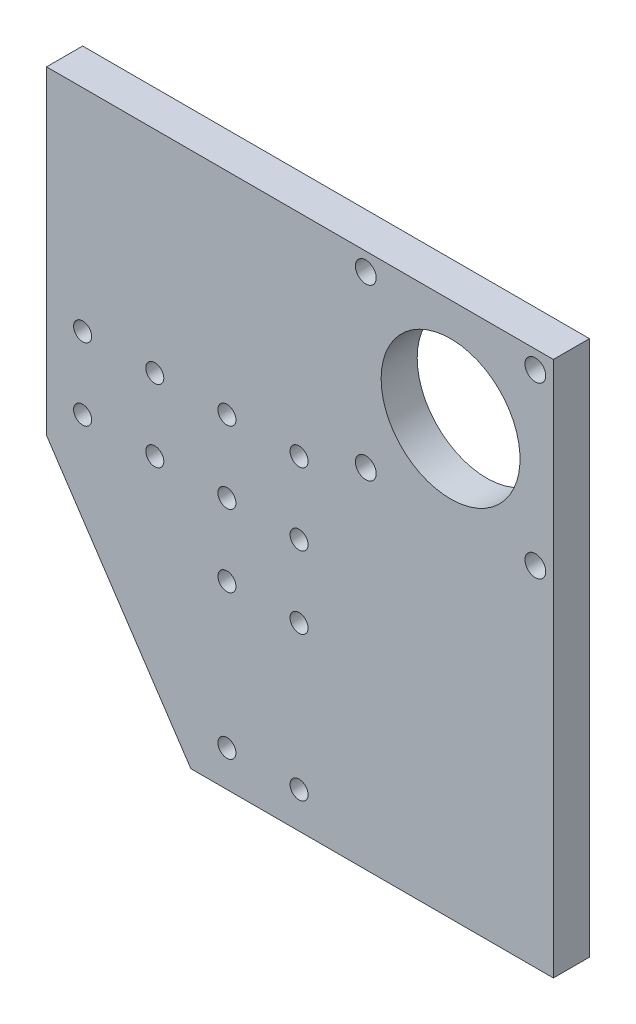
ISO-10303-21;
HEADER;
FILE_DESCRIPTION(('STEP AP214'),'2;1');
FILE_NAME('part.step','',(''),(''),'','','');
FILE_SCHEMA(('AUTOMOTIVE_DESIGN { 1 0 10303 214 1 1 1 1 }'));
ENDSEC;
DATA;
#1=APPLICATION_CONTEXT('core data for automotive mechanical design processes');
#2=APPLICATION_PROTOCOL_DEFINITION('international standard','automotive_design',2000,#1);
#3=PRODUCT_CONTEXT('',#1,'mechanical');
#4=PRODUCT('Part','Part','',(#3));
#5=PRODUCT_RELATED_PRODUCT_CATEGORY('part','',(#4));
#6=PRODUCT_DEFINITION_FORMATION('','',#4);
#7=PRODUCT_DEFINITION_CONTEXT('part definition',#1,'design');
#8=PRODUCT_DEFINITION('design','',#6,#7);
#9=PRODUCT_DEFINITION_SHAPE('','',#8);
#10=(LENGTH_UNIT() NAMED_UNIT(*) SI_UNIT(.MILLI.,.METRE.));
#11=(NAMED_UNIT(*) PLANE_ANGLE_UNIT() SI_UNIT($,.RADIAN.));
#12=(NAMED_UNIT(*) SI_UNIT($,.STERADIAN.) SOLID_ANGLE_UNIT());
#13=UNCERTAINTY_MEASURE_WITH_UNIT(LENGTH_MEASURE(1.E-05),#10,'distance_accuracy_value','');
#14=(GEOMETRIC_REPRESENTATION_CONTEXT(3) GLOBAL_UNCERTAINTY_ASSIGNED_CONTEXT((#13)) GLOBAL_UNIT_ASSIGNED_CONTEXT((#10,
#11,#12)) REPRESENTATION_CONTEXT('',''));
#15=CARTESIAN_POINT('',(0.,0.,0.));
#16=DIRECTION('',(0.,0.,1.));
#17=DIRECTION('',(1.,0.,0.));
#18=AXIS2_PLACEMENT_3D('',#15,#16,#17);
#19=CARTESIAN_POINT('',(0.,0.,10.));
#20=DIRECTION('',(0.832050294337844,0.554700196225229,0.));
#21=DIRECTION('',(-0.554700196225229,0.832050294337844,0.));
#22=AXIS2_PLACEMENT_3D('',#19,#20,#21);
#23=PLANE('',#22);
#24=DIRECTION('',(0.554700196225229,-0.832050294337844,0.));
#25=VECTOR('',#24,1.);
#26=CARTESIAN_POINT('',(0.,0.,0.));
#27=LINE('',#26,#25);
#28=CARTESIAN_POINT('',(-40.,60.,0.));
#29=VERTEX_POINT('',#28);
#30=CARTESIAN_POINT('',(0.,0.,0.));
#31=VERTEX_POINT('',#30);
#32=EDGE_CURVE('E122',#29,#31,#27,.T.);
#33=ORIENTED_EDGE('',*,*,#32,.T.);
#34=DIRECTION('',(0.,0.,-1.));
#35=VECTOR('',#34,1.);
#36=CARTESIAN_POINT('',(0.,0.,10.));
#37=LINE('',#36,#35);
#38=CARTESIAN_POINT('',(0.,0.,10.));
#39=VERTEX_POINT('',#38);
#40=EDGE_CURVE('E11',#39,#31,#37,.T.);
#41=ORIENTED_EDGE('',*,*,#40,.F.);
#42=DIRECTION('',(0.554700196225229,-0.832050294337844,0.));
#43=VECTOR('',#42,1.);
#44=CARTESIAN_POINT('',(0.,0.,10.));
#45=LINE('',#44,#43);
#46=CARTESIAN_POINT('',(-40.,60.,10.));
#47=VERTEX_POINT('',#46);
#48=EDGE_CURVE('E136',#47,#39,#45,.T.);
#49=ORIENTED_EDGE('',*,*,#48,.F.);
#50=DIRECTION('',(0.,0.,-1.));
#51=VECTOR('',#50,1.);
#52=CARTESIAN_POINT('',(-40.,60.,10.));
#53=LINE('',#52,#51);
#54=EDGE_CURVE('E118',#47,#29,#53,.T.);
#55=ORIENTED_EDGE('',*,*,#54,.T.);
#56=EDGE_LOOP('',(#33,#41,#49,#55));
#57=FACE_BOUND('',#56,.T.);
#58=ADVANCED_FACE('F43',(#57),#23,.F.);
#59=CARTESIAN_POINT('',(0.,0.,10.));
#60=DIRECTION('',(0.,1.,0.));
#61=DIRECTION('',(0.,0.,1.));
#62=AXIS2_PLACEMENT_3D('',#59,#60,#61);
#63=PLANE('',#62);
#64=DIRECTION('',(1.,0.,0.));
#65=VECTOR('',#64,1.);
#66=CARTESIAN_POINT('',(0.,0.,0.));
#67=LINE('',#66,#65);
#68=CARTESIAN_POINT('',(100.5,0.,0.));
#69=VERTEX_POINT('',#68);
#70=EDGE_CURVE('E126',#31,#69,#67,.T.);
#71=ORIENTED_EDGE('',*,*,#70,.T.);
#72=DIRECTION('',(0.,0.,-1.));
#73=VECTOR('',#72,1.);
#74=CARTESIAN_POINT('',(100.5,0.,10.));
#75=LINE('',#74,#73);
#76=CARTESIAN_POINT('',(100.5,0.,10.));
#77=VERTEX_POINT('',#76);
#78=EDGE_CURVE('E52',#77,#69,#75,.T.);
#79=ORIENTED_EDGE('',*,*,#78,.F.);
#80=DIRECTION('',(1.,0.,0.));
#81=VECTOR('',#80,1.);
#82=CARTESIAN_POINT('',(0.,0.,10.));
#83=LINE('',#82,#81);
#84=EDGE_CURVE('E94',#39,#77,#83,.T.);
#85=ORIENTED_EDGE('',*,*,#84,.F.);
#86=ORIENTED_EDGE('',*,*,#40,.T.);
#87=EDGE_LOOP('',(#71,#79,#85,#86));
#88=FACE_BOUND('',#87,.T.);
#89=ADVANCED_FACE('F159',(#88),#63,.F.);
#90=CARTESIAN_POINT('',(100.5,148.49893218,10.));
#91=DIRECTION('',(-1.,0.,0.));
#92=DIRECTION('',(0.,-1.,0.));
#93=AXIS2_PLACEMENT_3D('',#90,#91,#92);
#94=PLANE('',#93);
#95=DIRECTION('',(0.,1.,0.));
#96=VECTOR('',#95,1.);
#97=CARTESIAN_POINT('',(100.5,148.49893218,0.));
#98=LINE('',#97,#96);
#99=CARTESIAN_POINT('',(100.5,148.49893218,0.));
#100=VERTEX_POINT('',#99);
#101=EDGE_CURVE('E110',#69,#100,#98,.T.);
#102=ORIENTED_EDGE('',*,*,#101,.T.);
#103=DIRECTION('',(0.,0.,-1.));
#104=VECTOR('',#103,1.);
#105=CARTESIAN_POINT('',(100.5,148.49893218,10.));
#106=LINE('',#105,#104);
#107=CARTESIAN_POINT('',(100.5,148.49893218,10.));
#108=VERTEX_POINT('',#107);
#109=EDGE_CURVE('E107',#108,#100,#106,.T.);
#110=ORIENTED_EDGE('',*,*,#109,.F.);
#111=DIRECTION('',(0.,1.,0.));
#112=VECTOR('',#111,1.);
#113=CARTESIAN_POINT('',(100.5,148.49893218,10.));
#114=LINE('',#113,#112);
#115=EDGE_CURVE('E98',#77,#108,#114,.T.);
#116=ORIENTED_EDGE('',*,*,#115,.F.);
#117=ORIENTED_EDGE('',*,*,#78,.T.);
#118=EDGE_LOOP('',(#102,#110,#116,#117));
#119=FACE_BOUND('',#118,.T.);
#120=ADVANCED_FACE('F108',(#119),#94,.F.);
#121=CARTESIAN_POINT('',(-40.,148.49893218,10.));
#122=DIRECTION('',(0.,-1.,0.));
#123=DIRECTION('',(0.,0.,-1.));
#124=AXIS2_PLACEMENT_3D('',#121,#122,#123);
#125=PLANE('',#124);
#126=DIRECTION('',(-1.,0.,0.));
#127=VECTOR('',#126,1.);
#128=CARTESIAN_POINT('',(-40.,148.49893218,0.));
#129=LINE('',#128,#127);
#130=CARTESIAN_POINT('',(-40.,148.49893218,0.));
#131=VERTEX_POINT('',#130);
#132=EDGE_CURVE('E80',#100,#131,#129,.T.);
#133=ORIENTED_EDGE('',*,*,#132,.T.);
#134=DIRECTION('',(0.,0.,-1.));
#135=VECTOR('',#134,1.);
#136=CARTESIAN_POINT('',(-40.,148.49893218,10.));
#137=LINE('',#136,#135);
#138=CARTESIAN_POINT('',(-40.,148.49893218,10.));
#139=VERTEX_POINT('',#138);
#140=EDGE_CURVE('E112',#139,#131,#137,.T.);
#141=ORIENTED_EDGE('',*,*,#140,.F.);
#142=DIRECTION('',(-1.,0.,0.));
#143=VECTOR('',#142,1.);
#144=CARTESIAN_POINT('',(-40.,148.49893218,10.));
#145=LINE('',#144,#143);
#146=EDGE_CURVE('E102',#108,#139,#145,.T.);
#147=ORIENTED_EDGE('',*,*,#146,.F.);
#148=ORIENTED_EDGE('',*,*,#109,.T.);
#149=EDGE_LOOP('',(#133,#141,#147,#148));
#150=FACE_BOUND('',#149,.T.);
#151=ADVANCED_FACE('F114',(#150),#125,.F.);
#152=CARTESIAN_POINT('',(-40.,60.,10.));
#153=DIRECTION('',(1.,0.,0.));
#154=DIRECTION('',(0.,0.,-1.));
#155=AXIS2_PLACEMENT_3D('',#152,#153,#154);
#156=PLANE('',#155);
#157=DIRECTION('',(0.,-1.,0.));
#158=VECTOR('',#157,1.);
#159=CARTESIAN_POINT('',(-40.,60.,0.));
#160=LINE('',#159,#158);
#161=EDGE_CURVE('E86',#131,#29,#160,.T.);
#162=ORIENTED_EDGE('',*,*,#161,.T.);
#163=ORIENTED_EDGE('',*,*,#54,.F.);
#164=DIRECTION('',(0.,-1.,0.));
#165=VECTOR('',#164,1.);
#166=CARTESIAN_POINT('',(-40.,60.,10.));
#167=LINE('',#166,#165);
#168=EDGE_CURVE('E60',#139,#47,#167,.T.);
#169=ORIENTED_EDGE('',*,*,#168,.F.);
#170=ORIENTED_EDGE('',*,*,#140,.T.);
#171=EDGE_LOOP('',(#162,#163,#169,#170));
#172=FACE_BOUND('',#171,.T.);
#173=ADVANCED_FACE('F147',(#172),#156,.F.);
#174=CARTESIAN_POINT('',(0.,0.,10.));
#175=DIRECTION('',(0.,0.,-1.));
#176=DIRECTION('',(-1.,0.,0.));
#177=AXIS2_PLACEMENT_3D('',#174,#175,#176);
#178=PLANE('',#177);
#179=CARTESIAN_POINT('',(30.,50.,10.));
#180=DIRECTION('',(0.,0.,-1.));
#181=DIRECTION('',(-1.,0.,0.));
#182=AXIS2_PLACEMENT_3D('',#179,#180,#181);
#183=CIRCLE('',#182,2.5);
#184=CARTESIAN_POINT('',(27.5,50.,10.));
#185=VERTEX_POINT('',#184);
#186=EDGE_CURVE('E429',#185,#185,#183,.F.);
#187=ORIENTED_EDGE('',*,*,#186,.F.);
#188=EDGE_LOOP('',(#187));
#189=FACE_BOUND('',#188,.T.);
#190=CARTESIAN_POINT('',(10.,50.,10.));
#191=DIRECTION('',(0.,0.,-1.));
#192=DIRECTION('',(-1.,0.,0.));
#193=AXIS2_PLACEMENT_3D('',#190,#191,#192);
#194=CIRCLE('',#193,2.5);
#195=CARTESIAN_POINT('',(7.50000000000002,50.,10.));
#196=VERTEX_POINT('',#195);
#197=EDGE_CURVE('E438',#196,#196,#194,.F.);
#198=ORIENTED_EDGE('',*,*,#197,.F.);
#199=EDGE_LOOP('',(#198));
#200=FACE_BOUND('',#199,.T.);
#201=CARTESIAN_POINT('',(30.,10.,10.));
#202=DIRECTION('',(0.,0.,-1.));
#203=DIRECTION('',(-1.,0.,0.));
#204=AXIS2_PLACEMENT_3D('',#201,#202,#203);
#205=CIRCLE('',#204,2.5);
#206=CARTESIAN_POINT('',(27.5,10.,10.));
#207=VERTEX_POINT('',#206);
#208=EDGE_CURVE('E448',#207,#207,#205,.F.);
#209=ORIENTED_EDGE('',*,*,#208,.F.);
#210=EDGE_LOOP('',(#209));
#211=FACE_BOUND('',#210,.T.);
#212=CARTESIAN_POINT('',(10.,10.,10.));
#213=DIRECTION('',(0.,0.,-1.));
#214=DIRECTION('',(-1.,0.,0.));
#215=AXIS2_PLACEMENT_3D('',#212,#213,#214);
#216=CIRCLE('',#215,2.5);
#217=CARTESIAN_POINT('',(7.50000000000001,10.,10.));
#218=VERTEX_POINT('',#217);
#219=EDGE_CURVE('E456',#218,#218,#216,.F.);
#220=ORIENTED_EDGE('',*,*,#219,.F.);
#221=EDGE_LOOP('',(#220));
#222=FACE_BOUND('',#221,.T.);
#223=CARTESIAN_POINT('',(-30.,70.,10.));
#224=DIRECTION('',(0.,0.,-1.));
#225=DIRECTION('',(-1.,0.,0.));
#226=AXIS2_PLACEMENT_3D('',#223,#224,#225);
#227=CIRCLE('',#226,2.5);
#228=CARTESIAN_POINT('',(-32.5,70.,10.));
#229=VERTEX_POINT('',#228);
#230=EDGE_CURVE('E464',#229,#229,#227,.F.);
#231=ORIENTED_EDGE('',*,*,#230,.F.);
#232=EDGE_LOOP('',(#231));
#233=FACE_BOUND('',#232,.T.);
#234=CARTESIAN_POINT('',(-30.,90.,10.));
#235=DIRECTION('',(0.,0.,-1.));
#236=DIRECTION('',(-1.,0.,0.));
#237=AXIS2_PLACEMENT_3D('',#234,#235,#236);
#238=CIRCLE('',#237,2.5);
#239=CARTESIAN_POINT('',(-32.5,90.,10.));
#240=VERTEX_POINT('',#239);
#241=EDGE_CURVE('E472',#240,#240,#238,.F.);
#242=ORIENTED_EDGE('',*,*,#241,.F.);
#243=EDGE_LOOP('',(#242));
#244=FACE_BOUND('',#243,.T.);
#245=CARTESIAN_POINT('',(-10.,90.,10.));
#246=DIRECTION('',(0.,0.,-1.));
#247=DIRECTION('',(-1.,0.,0.));
#248=AXIS2_PLACEMENT_3D('',#245,#246,#247);
#249=CIRCLE('',#248,2.5);
#250=CARTESIAN_POINT('',(-12.5,90.,10.));
#251=VERTEX_POINT('',#250);
#252=EDGE_CURVE('E480',#251,#251,#249,.F.);
#253=ORIENTED_EDGE('',*,*,#252,.F.);
#254=EDGE_LOOP('',(#253));
#255=FACE_BOUND('',#254,.T.);
#256=CARTESIAN_POINT('',(-10.,70.,10.));
#257=DIRECTION('',(0.,0.,-1.));
#258=DIRECTION('',(-1.,0.,0.));
#259=AXIS2_PLACEMENT_3D('',#256,#257,#258);
#260=CIRCLE('',#259,2.5);
#261=CARTESIAN_POINT('',(-12.5,70.,10.));
#262=VERTEX_POINT('',#261);
#263=EDGE_CURVE('E488',#262,#262,#260,.F.);
#264=ORIENTED_EDGE('',*,*,#263,.F.);
#265=EDGE_LOOP('',(#264));
#266=FACE_BOUND('',#265,.T.);
#267=CARTESIAN_POINT('',(48.5,96.49893218,10.));
#268=DIRECTION('',(0.,0.,-1.));
#269=DIRECTION('',(-1.,0.,0.));
#270=AXIS2_PLACEMENT_3D('',#267,#268,#269);
#271=CIRCLE('',#270,2.88500075074936);
#272=CARTESIAN_POINT('',(45.6149992492506,96.49893218,10.));
#273=VERTEX_POINT('',#272);
#274=EDGE_CURVE('E569',#273,#273,#271,.F.);
#275=ORIENTED_EDGE('',*,*,#274,.F.);
#276=EDGE_LOOP('',(#275));
#277=FACE_BOUND('',#276,.T.);
#278=CARTESIAN_POINT('',(95.5,96.49893218,10.));
#279=DIRECTION('',(0.,0.,-1.));
#280=DIRECTION('',(-1.,0.,0.));
#281=AXIS2_PLACEMENT_3D('',#278,#279,#280);
#282=CIRCLE('',#281,2.88500075074935);
#283=CARTESIAN_POINT('',(92.6149992492506,96.49893218,10.));
#284=VERTEX_POINT('',#283);
#285=EDGE_CURVE('E570',#284,#284,#282,.F.);
#286=ORIENTED_EDGE('',*,*,#285,.F.);
#287=EDGE_LOOP('',(#286));
#288=FACE_BOUND('',#287,.T.);
#289=CARTESIAN_POINT('',(10.,70.,10.));
#290=DIRECTION('',(0.,0.,-1.));
#291=DIRECTION('',(-1.,0.,0.));
#292=AXIS2_PLACEMENT_3D('',#289,#290,#291);
#293=CIRCLE('',#292,2.5);
#294=CARTESIAN_POINT('',(7.50000000000001,70.,10.));
#295=VERTEX_POINT('',#294);
#296=EDGE_CURVE('E581',#295,#295,#293,.F.);
#297=ORIENTED_EDGE('',*,*,#296,.F.);
#298=EDGE_LOOP('',(#297));
#299=FACE_BOUND('',#298,.T.);
#300=CARTESIAN_POINT('',(95.5,143.49893218,10.));
#301=DIRECTION('',(0.,0.,-1.));
#302=DIRECTION('',(-1.,0.,0.));
#303=AXIS2_PLACEMENT_3D('',#300,#301,#302);
#304=CIRCLE('',#303,2.88500075074935);
#305=CARTESIAN_POINT('',(92.6149992492506,143.49893218,10.));
#306=VERTEX_POINT('',#305);
#307=EDGE_CURVE('E582',#306,#306,#304,.F.);
#308=ORIENTED_EDGE('',*,*,#307,.F.);
#309=EDGE_LOOP('',(#308));
#310=FACE_BOUND('',#309,.T.);
#311=CARTESIAN_POINT('',(10.,90.,10.));
#312=DIRECTION('',(0.,0.,-1.));
#313=DIRECTION('',(-1.,0.,0.));
#314=AXIS2_PLACEMENT_3D('',#311,#312,#313);
#315=CIRCLE('',#314,2.5);
#316=CARTESIAN_POINT('',(7.50000000000002,90.,10.));
#317=VERTEX_POINT('',#316);
#318=EDGE_CURVE('E554',#317,#317,#315,.F.);
#319=ORIENTED_EDGE('',*,*,#318,.F.);
#320=EDGE_LOOP('',(#319));
#321=FACE_BOUND('',#320,.T.);
#322=CARTESIAN_POINT('',(30.,90.,10.));
#323=DIRECTION('',(0.,0.,-1.));
#324=DIRECTION('',(-1.,0.,0.));
#325=AXIS2_PLACEMENT_3D('',#322,#323,#324);
#326=CIRCLE('',#325,2.5);
#327=CARTESIAN_POINT('',(27.5,90.,10.));
#328=VERTEX_POINT('',#327);
#329=EDGE_CURVE('E559',#328,#328,#326,.F.);
#330=ORIENTED_EDGE('',*,*,#329,.F.);
#331=EDGE_LOOP('',(#330));
#332=FACE_BOUND('',#331,.T.);
#333=CARTESIAN_POINT('',(30.,70.,10.));
#334=DIRECTION('',(0.,0.,-1.));
#335=DIRECTION('',(-1.,0.,0.));
#336=AXIS2_PLACEMENT_3D('',#333,#334,#335);
#337=CIRCLE('',#336,2.5);
#338=CARTESIAN_POINT('',(27.5,70.,10.));
#339=VERTEX_POINT('',#338);
#340=EDGE_CURVE('E543',#339,#339,#337,.F.);
#341=ORIENTED_EDGE('',*,*,#340,.F.);
#342=EDGE_LOOP('',(#341));
#343=FACE_BOUND('',#342,.T.);
#344=CARTESIAN_POINT('',(48.5,143.49893218,10.));
#345=DIRECTION('',(0.,0.,-1.));
#346=DIRECTION('',(-1.,0.,0.));
#347=AXIS2_PLACEMENT_3D('',#344,#345,#346);
#348=CIRCLE('',#347,2.88500075074936);
#349=CARTESIAN_POINT('',(45.6149992492506,143.49893218,10.));
#350=VERTEX_POINT('',#349);
#351=EDGE_CURVE('E544',#350,#350,#348,.F.);
#352=ORIENTED_EDGE('',*,*,#351,.F.);
#353=EDGE_LOOP('',(#352));
#354=FACE_BOUND('',#353,.T.);
#355=CARTESIAN_POINT('',(72.,119.99893218,10.));
#356=DIRECTION('',(0.,0.,-1.));
#357=DIRECTION('',(-1.,0.,0.));
#358=AXIS2_PLACEMENT_3D('',#355,#356,#357);
#359=CIRCLE('',#358,19.25);
#360=CARTESIAN_POINT('',(52.75,119.99893218,10.));
#361=VERTEX_POINT('',#360);
#362=EDGE_CURVE('E127',#361,#361,#359,.F.);
#363=ORIENTED_EDGE('',*,*,#362,.F.);
#364=EDGE_LOOP('',(#363));
#365=FACE_BOUND('',#364,.T.);
#366=ORIENTED_EDGE('',*,*,#48,.T.);
#367=ORIENTED_EDGE('',*,*,#84,.T.);
#368=ORIENTED_EDGE('',*,*,#115,.T.);
#369=ORIENTED_EDGE('',*,*,#146,.T.);
#370=ORIENTED_EDGE('',*,*,#168,.T.);
#371=EDGE_LOOP('',(#366,#367,#368,#369,#370));
#372=FACE_BOUND('',#371,.T.);
#373=ADVANCED_FACE('F100',(#189,#200,#211,#222,#233,#244,#255,#266,#277,#288,#299,#310,#321,
#332,#343,#354,#365,#372),#178,.F.);
#374=CARTESIAN_POINT('',(0.,0.,0.));
#375=DIRECTION('',(0.,0.,-1.));
#376=DIRECTION('',(-1.,0.,0.));
#377=AXIS2_PLACEMENT_3D('',#374,#375,#376);
#378=PLANE('',#377);
#379=CARTESIAN_POINT('',(30.,50.,0.));
#380=DIRECTION('',(0.,0.,-1.));
#381=DIRECTION('',(-1.,0.,0.));
#382=AXIS2_PLACEMENT_3D('',#379,#380,#381);
#383=CIRCLE('',#382,2.5);
#384=CARTESIAN_POINT('',(27.5,50.,0.));
#385=VERTEX_POINT('',#384);
#386=EDGE_CURVE('E426',#385,#385,#383,.T.);
#387=ORIENTED_EDGE('',*,*,#386,.F.);
#388=EDGE_LOOP('',(#387));
#389=FACE_BOUND('',#388,.T.);
#390=CARTESIAN_POINT('',(10.,50.,0.));
#391=DIRECTION('',(0.,0.,-1.));
#392=DIRECTION('',(-1.,0.,0.));
#393=AXIS2_PLACEMENT_3D('',#390,#391,#392);
#394=CIRCLE('',#393,2.5);
#395=CARTESIAN_POINT('',(7.50000000000002,50.,0.));
#396=VERTEX_POINT('',#395);
#397=EDGE_CURVE('E431',#396,#396,#394,.T.);
#398=ORIENTED_EDGE('',*,*,#397,.F.);
#399=EDGE_LOOP('',(#398));
#400=FACE_BOUND('',#399,.T.);
#401=CARTESIAN_POINT('',(30.,10.,0.));
#402=DIRECTION('',(0.,0.,-1.));
#403=DIRECTION('',(-1.,0.,0.));
#404=AXIS2_PLACEMENT_3D('',#401,#402,#403);
#405=CIRCLE('',#404,2.5);
#406=CARTESIAN_POINT('',(27.5,10.,0.));
#407=VERTEX_POINT('',#406);
#408=EDGE_CURVE('E446',#407,#407,#405,.T.);
#409=ORIENTED_EDGE('',*,*,#408,.F.);
#410=EDGE_LOOP('',(#409));
#411=FACE_BOUND('',#410,.T.);
#412=CARTESIAN_POINT('',(10.,10.,0.));
#413=DIRECTION('',(0.,0.,-1.));
#414=DIRECTION('',(-1.,0.,0.));
#415=AXIS2_PLACEMENT_3D('',#412,#413,#414);
#416=CIRCLE('',#415,2.5);
#417=CARTESIAN_POINT('',(7.50000000000001,10.,0.));
#418=VERTEX_POINT('',#417);
#419=EDGE_CURVE('E452',#418,#418,#416,.T.);
#420=ORIENTED_EDGE('',*,*,#419,.F.);
#421=EDGE_LOOP('',(#420));
#422=FACE_BOUND('',#421,.T.);
#423=CARTESIAN_POINT('',(-30.,70.,0.));
#424=DIRECTION('',(0.,0.,-1.));
#425=DIRECTION('',(-1.,0.,0.));
#426=AXIS2_PLACEMENT_3D('',#423,#424,#425);
#427=CIRCLE('',#426,2.5);
#428=CARTESIAN_POINT('',(-32.5,70.,0.));
#429=VERTEX_POINT('',#428);
#430=EDGE_CURVE('E460',#429,#429,#427,.T.);
#431=ORIENTED_EDGE('',*,*,#430,.F.);
#432=EDGE_LOOP('',(#431));
#433=FACE_BOUND('',#432,.T.);
#434=CARTESIAN_POINT('',(-30.,90.,0.));
#435=DIRECTION('',(0.,0.,-1.));
#436=DIRECTION('',(-1.,0.,0.));
#437=AXIS2_PLACEMENT_3D('',#434,#435,#436);
#438=CIRCLE('',#437,2.5);
#439=CARTESIAN_POINT('',(-32.5,90.,0.));
#440=VERTEX_POINT('',#439);
#441=EDGE_CURVE('E468',#440,#440,#438,.T.);
#442=ORIENTED_EDGE('',*,*,#441,.F.);
#443=EDGE_LOOP('',(#442));
#444=FACE_BOUND('',#443,.T.);
#445=CARTESIAN_POINT('',(-10.,90.,0.));
#446=DIRECTION('',(0.,0.,-1.));
#447=DIRECTION('',(-1.,0.,0.));
#448=AXIS2_PLACEMENT_3D('',#445,#446,#447);
#449=CIRCLE('',#448,2.5);
#450=CARTESIAN_POINT('',(-12.5,90.,0.));
#451=VERTEX_POINT('',#450);
#452=EDGE_CURVE('E476',#451,#451,#449,.T.);
#453=ORIENTED_EDGE('',*,*,#452,.F.);
#454=EDGE_LOOP('',(#453));
#455=FACE_BOUND('',#454,.T.);
#456=CARTESIAN_POINT('',(-10.,70.,0.));
#457=DIRECTION('',(0.,0.,-1.));
#458=DIRECTION('',(-1.,0.,0.));
#459=AXIS2_PLACEMENT_3D('',#456,#457,#458);
#460=CIRCLE('',#459,2.5);
#461=CARTESIAN_POINT('',(-12.5,70.,0.));
#462=VERTEX_POINT('',#461);
#463=EDGE_CURVE('E484',#462,#462,#460,.T.);
#464=ORIENTED_EDGE('',*,*,#463,.F.);
#465=EDGE_LOOP('',(#464));
#466=FACE_BOUND('',#465,.T.);
#467=CARTESIAN_POINT('',(48.5,96.49893218,0.));
#468=DIRECTION('',(0.,0.,-1.));
#469=DIRECTION('',(-1.,0.,0.));
#470=AXIS2_PLACEMENT_3D('',#467,#468,#469);
#471=CIRCLE('',#470,2.88500075074936);
#472=CARTESIAN_POINT('',(45.6149992492506,96.49893218,0.));
#473=VERTEX_POINT('',#472);
#474=EDGE_CURVE('E516',#473,#473,#471,.T.);
#475=ORIENTED_EDGE('',*,*,#474,.F.);
#476=EDGE_LOOP('',(#475));
#477=FACE_BOUND('',#476,.T.);
#478=CARTESIAN_POINT('',(95.5,96.49893218,0.));
#479=DIRECTION('',(0.,0.,-1.));
#480=DIRECTION('',(-1.,0.,0.));
#481=AXIS2_PLACEMENT_3D('',#478,#479,#480);
#482=CIRCLE('',#481,2.88500075074935);
#483=CARTESIAN_POINT('',(92.6149992492506,96.49893218,0.));
#484=VERTEX_POINT('',#483);
#485=EDGE_CURVE('E520',#484,#484,#482,.T.);
#486=ORIENTED_EDGE('',*,*,#485,.F.);
#487=EDGE_LOOP('',(#486));
#488=FACE_BOUND('',#487,.T.);
#489=CARTESIAN_POINT('',(10.,70.,0.));
#490=DIRECTION('',(0.,0.,-1.));
#491=DIRECTION('',(-1.,0.,0.));
#492=AXIS2_PLACEMENT_3D('',#489,#490,#491);
#493=CIRCLE('',#492,2.5);
#494=CARTESIAN_POINT('',(7.50000000000001,70.,0.));
#495=VERTEX_POINT('',#494);
#496=EDGE_CURVE('E524',#495,#495,#493,.T.);
#497=ORIENTED_EDGE('',*,*,#496,.F.);
#498=EDGE_LOOP('',(#497));
#499=FACE_BOUND('',#498,.T.);
#500=CARTESIAN_POINT('',(95.5,143.49893218,0.));
#501=DIRECTION('',(0.,0.,-1.));
#502=DIRECTION('',(-1.,0.,0.));
#503=AXIS2_PLACEMENT_3D('',#500,#501,#502);
#504=CIRCLE('',#503,2.88500075074935);
#505=CARTESIAN_POINT('',(92.6149992492506,143.49893218,0.));
#506=VERTEX_POINT('',#505);
#507=EDGE_CURVE('E528',#506,#506,#504,.T.);
#508=ORIENTED_EDGE('',*,*,#507,.F.);
#509=EDGE_LOOP('',(#508));
#510=FACE_BOUND('',#509,.T.);
#511=CARTESIAN_POINT('',(10.,90.,0.));
#512=DIRECTION('',(0.,0.,-1.));
#513=DIRECTION('',(-1.,0.,0.));
#514=AXIS2_PLACEMENT_3D('',#511,#512,#513);
#515=CIRCLE('',#514,2.5);
#516=CARTESIAN_POINT('',(7.50000000000002,90.,0.));
#517=VERTEX_POINT('',#516);
#518=EDGE_CURVE('E492',#517,#517,#515,.T.);
#519=ORIENTED_EDGE('',*,*,#518,.F.);
#520=EDGE_LOOP('',(#519));
#521=FACE_BOUND('',#520,.T.);
#522=CARTESIAN_POINT('',(30.,90.,0.));
#523=DIRECTION('',(0.,0.,-1.));
#524=DIRECTION('',(-1.,0.,0.));
#525=AXIS2_PLACEMENT_3D('',#522,#523,#524);
#526=CIRCLE('',#525,2.5);
#527=CARTESIAN_POINT('',(27.5,90.,0.));
#528=VERTEX_POINT('',#527);
#529=EDGE_CURVE('E441',#528,#528,#526,.T.);
#530=ORIENTED_EDGE('',*,*,#529,.F.);
#531=EDGE_LOOP('',(#530));
#532=FACE_BOUND('',#531,.T.);
#533=CARTESIAN_POINT('',(30.,70.,0.));
#534=DIRECTION('',(0.,0.,-1.));
#535=DIRECTION('',(-1.,0.,0.));
#536=AXIS2_PLACEMENT_3D('',#533,#534,#535);
#537=CIRCLE('',#536,2.5);
#538=CARTESIAN_POINT('',(27.5,70.,0.));
#539=VERTEX_POINT('',#538);
#540=EDGE_CURVE('E538',#539,#539,#537,.T.);
#541=ORIENTED_EDGE('',*,*,#540,.F.);
#542=EDGE_LOOP('',(#541));
#543=FACE_BOUND('',#542,.T.);
#544=CARTESIAN_POINT('',(48.5,143.49893218,0.));
#545=DIRECTION('',(0.,0.,-1.));
#546=DIRECTION('',(-1.,0.,0.));
#547=AXIS2_PLACEMENT_3D('',#544,#545,#546);
#548=CIRCLE('',#547,2.88500075074936);
#549=CARTESIAN_POINT('',(45.6149992492506,143.49893218,0.));
#550=VERTEX_POINT('',#549);
#551=EDGE_CURVE('E541',#550,#550,#548,.T.);
#552=ORIENTED_EDGE('',*,*,#551,.F.);
#553=EDGE_LOOP('',(#552));
#554=FACE_BOUND('',#553,.T.);
#555=CARTESIAN_POINT('',(72.,119.99893218,0.));
#556=DIRECTION('',(0.,0.,-1.));
#557=DIRECTION('',(-1.,0.,0.));
#558=AXIS2_PLACEMENT_3D('',#555,#556,#557);
#559=CIRCLE('',#558,19.25);
#560=CARTESIAN_POINT('',(52.75,119.99893218,0.));
#561=VERTEX_POINT('',#560);
#562=EDGE_CURVE('E435',#561,#561,#559,.T.);
#563=ORIENTED_EDGE('',*,*,#562,.F.);
#564=EDGE_LOOP('',(#563));
#565=FACE_BOUND('',#564,.T.);
#566=ORIENTED_EDGE('',*,*,#32,.F.);
#567=ORIENTED_EDGE('',*,*,#161,.F.);
#568=ORIENTED_EDGE('',*,*,#132,.F.);
#569=ORIENTED_EDGE('',*,*,#101,.F.);
#570=ORIENTED_EDGE('',*,*,#70,.F.);
#571=EDGE_LOOP('',(#566,#567,#568,#569,#570));
#572=FACE_BOUND('',#571,.T.);
#573=ADVANCED_FACE('F143',(#389,#400,#411,#422,#433,#444,#455,#466,#477,#488,#499,#510,#521,
#532,#543,#554,#565,#572),#378,.T.);
#574=CARTESIAN_POINT('',(72.,119.99893218,10.001));
#575=DIRECTION('',(0.,0.,-1.));
#576=DIRECTION('',(-1.,0.,0.));
#577=AXIS2_PLACEMENT_3D('',#574,#575,#576);
#578=CYLINDRICAL_SURFACE('',#577,19.25);
#579=ORIENTED_EDGE('',*,*,#562,.T.);
#580=EDGE_LOOP('',(#579));
#581=FACE_BOUND('',#580,.T.);
#582=ORIENTED_EDGE('',*,*,#362,.T.);
#583=EDGE_LOOP('',(#582));
#584=FACE_BOUND('',#583,.T.);
#585=ADVANCED_FACE('F195',(#581,#584),#578,.F.);
#586=CARTESIAN_POINT('',(48.5,143.49893218,10.001));
#587=DIRECTION('',(0.,0.,-1.));
#588=DIRECTION('',(-1.,0.,0.));
#589=AXIS2_PLACEMENT_3D('',#586,#587,#588);
#590=CYLINDRICAL_SURFACE('',#589,2.88500075074936);
#591=ORIENTED_EDGE('',*,*,#551,.T.);
#592=EDGE_LOOP('',(#591));
#593=FACE_BOUND('',#592,.T.);
#594=ORIENTED_EDGE('',*,*,#351,.T.);
#595=EDGE_LOOP('',(#594));
#596=FACE_BOUND('',#595,.T.);
#597=ADVANCED_FACE('F205',(#593,#596),#590,.F.);
#598=CARTESIAN_POINT('',(30.,70.,10.001));
#599=DIRECTION('',(0.,0.,-1.));
#600=DIRECTION('',(-1.,0.,0.));
#601=AXIS2_PLACEMENT_3D('',#598,#599,#600);
#602=CYLINDRICAL_SURFACE('',#601,2.5);
#603=ORIENTED_EDGE('',*,*,#540,.T.);
#604=EDGE_LOOP('',(#603));
#605=FACE_BOUND('',#604,.T.);
#606=ORIENTED_EDGE('',*,*,#340,.T.);
#607=EDGE_LOOP('',(#606));
#608=FACE_BOUND('',#607,.T.);
#609=ADVANCED_FACE('F216',(#605,#608),#602,.F.);
#610=CARTESIAN_POINT('',(30.,90.,10.001));
#611=DIRECTION('',(0.,0.,-1.));
#612=DIRECTION('',(-1.,0.,0.));
#613=AXIS2_PLACEMENT_3D('',#610,#611,#612);
#614=CYLINDRICAL_SURFACE('',#613,2.5);
#615=ORIENTED_EDGE('',*,*,#529,.T.);
#616=EDGE_LOOP('',(#615));
#617=FACE_BOUND('',#616,.T.);
#618=ORIENTED_EDGE('',*,*,#329,.T.);
#619=EDGE_LOOP('',(#618));
#620=FACE_BOUND('',#619,.T.);
#621=ADVANCED_FACE('F227',(#617,#620),#614,.F.);
#622=CARTESIAN_POINT('',(10.,90.,10.001));
#623=DIRECTION('',(0.,0.,-1.));
#624=DIRECTION('',(-1.,0.,0.));
#625=AXIS2_PLACEMENT_3D('',#622,#623,#624);
#626=CYLINDRICAL_SURFACE('',#625,2.5);
#627=ORIENTED_EDGE('',*,*,#518,.T.);
#628=EDGE_LOOP('',(#627));
#629=FACE_BOUND('',#628,.T.);
#630=ORIENTED_EDGE('',*,*,#318,.T.);
#631=EDGE_LOOP('',(#630));
#632=FACE_BOUND('',#631,.T.);
#633=ADVANCED_FACE('F238',(#629,#632),#626,.F.);
#634=CARTESIAN_POINT('',(95.5,143.49893218,10.001));
#635=DIRECTION('',(0.,0.,-1.));
#636=DIRECTION('',(-1.,0.,0.));
#637=AXIS2_PLACEMENT_3D('',#634,#635,#636);
#638=CYLINDRICAL_SURFACE('',#637,2.88500075074935);
#639=ORIENTED_EDGE('',*,*,#507,.T.);
#640=EDGE_LOOP('',(#639));
#641=FACE_BOUND('',#640,.T.);
#642=ORIENTED_EDGE('',*,*,#307,.T.);
#643=EDGE_LOOP('',(#642));
#644=FACE_BOUND('',#643,.T.);
#645=ADVANCED_FACE('F249',(#641,#644),#638,.F.);
#646=CARTESIAN_POINT('',(10.,70.,10.001));
#647=DIRECTION('',(0.,0.,-1.));
#648=DIRECTION('',(-1.,0.,0.));
#649=AXIS2_PLACEMENT_3D('',#646,#647,#648);
#650=CYLINDRICAL_SURFACE('',#649,2.5);
#651=ORIENTED_EDGE('',*,*,#496,.T.);
#652=EDGE_LOOP('',(#651));
#653=FACE_BOUND('',#652,.T.);
#654=ORIENTED_EDGE('',*,*,#296,.T.);
#655=EDGE_LOOP('',(#654));
#656=FACE_BOUND('',#655,.T.);
#657=ADVANCED_FACE('F260',(#653,#656),#650,.F.);
#658=CARTESIAN_POINT('',(95.5,96.49893218,10.001));
#659=DIRECTION('',(0.,0.,-1.));
#660=DIRECTION('',(-1.,0.,0.));
#661=AXIS2_PLACEMENT_3D('',#658,#659,#660);
#662=CYLINDRICAL_SURFACE('',#661,2.88500075074935);
#663=ORIENTED_EDGE('',*,*,#485,.T.);
#664=EDGE_LOOP('',(#663));
#665=FACE_BOUND('',#664,.T.);
#666=ORIENTED_EDGE('',*,*,#285,.T.);
#667=EDGE_LOOP('',(#666));
#668=FACE_BOUND('',#667,.T.);
#669=ADVANCED_FACE('F271',(#665,#668),#662,.F.);
#670=CARTESIAN_POINT('',(48.5,96.49893218,10.001));
#671=DIRECTION('',(0.,0.,-1.));
#672=DIRECTION('',(-1.,0.,0.));
#673=AXIS2_PLACEMENT_3D('',#670,#671,#672);
#674=CYLINDRICAL_SURFACE('',#673,2.88500075074936);
#675=ORIENTED_EDGE('',*,*,#474,.T.);
#676=EDGE_LOOP('',(#675));
#677=FACE_BOUND('',#676,.T.);
#678=ORIENTED_EDGE('',*,*,#274,.T.);
#679=EDGE_LOOP('',(#678));
#680=FACE_BOUND('',#679,.T.);
#681=ADVANCED_FACE('F282',(#677,#680),#674,.F.);
#682=CARTESIAN_POINT('',(-10.,70.,10.001));
#683=DIRECTION('',(0.,0.,-1.));
#684=DIRECTION('',(-1.,0.,0.));
#685=AXIS2_PLACEMENT_3D('',#682,#683,#684);
#686=CYLINDRICAL_SURFACE('',#685,2.5);
#687=ORIENTED_EDGE('',*,*,#463,.T.);
#688=EDGE_LOOP('',(#687));
#689=FACE_BOUND('',#688,.T.);
#690=ORIENTED_EDGE('',*,*,#263,.T.);
#691=EDGE_LOOP('',(#690));
#692=FACE_BOUND('',#691,.T.);
#693=ADVANCED_FACE('F293',(#689,#692),#686,.F.);
#694=CARTESIAN_POINT('',(-10.,90.,10.001));
#695=DIRECTION('',(0.,0.,-1.));
#696=DIRECTION('',(-1.,0.,0.));
#697=AXIS2_PLACEMENT_3D('',#694,#695,#696);
#698=CYLINDRICAL_SURFACE('',#697,2.5);
#699=ORIENTED_EDGE('',*,*,#452,.T.);
#700=EDGE_LOOP('',(#699));
#701=FACE_BOUND('',#700,.T.);
#702=ORIENTED_EDGE('',*,*,#252,.T.);
#703=EDGE_LOOP('',(#702));
#704=FACE_BOUND('',#703,.T.);
#705=ADVANCED_FACE('F304',(#701,#704),#698,.F.);
#706=CARTESIAN_POINT('',(-30.,90.,10.001));
#707=DIRECTION('',(0.,0.,-1.));
#708=DIRECTION('',(-1.,0.,0.));
#709=AXIS2_PLACEMENT_3D('',#706,#707,#708);
#710=CYLINDRICAL_SURFACE('',#709,2.5);
#711=ORIENTED_EDGE('',*,*,#441,.T.);
#712=EDGE_LOOP('',(#711));
#713=FACE_BOUND('',#712,.T.);
#714=ORIENTED_EDGE('',*,*,#241,.T.);
#715=EDGE_LOOP('',(#714));
#716=FACE_BOUND('',#715,.T.);
#717=ADVANCED_FACE('F315',(#713,#716),#710,.F.);
#718=CARTESIAN_POINT('',(-30.,70.,10.001));
#719=DIRECTION('',(0.,0.,-1.));
#720=DIRECTION('',(-1.,0.,0.));
#721=AXIS2_PLACEMENT_3D('',#718,#719,#720);
#722=CYLINDRICAL_SURFACE('',#721,2.5);
#723=ORIENTED_EDGE('',*,*,#430,.T.);
#724=EDGE_LOOP('',(#723));
#725=FACE_BOUND('',#724,.T.);
#726=ORIENTED_EDGE('',*,*,#230,.T.);
#727=EDGE_LOOP('',(#726));
#728=FACE_BOUND('',#727,.T.);
#729=ADVANCED_FACE('F326',(#725,#728),#722,.F.);
#730=CARTESIAN_POINT('',(10.,10.,10.001));
#731=DIRECTION('',(0.,0.,-1.));
#732=DIRECTION('',(-1.,0.,0.));
#733=AXIS2_PLACEMENT_3D('',#730,#731,#732);
#734=CYLINDRICAL_SURFACE('',#733,2.5);
#735=ORIENTED_EDGE('',*,*,#419,.T.);
#736=EDGE_LOOP('',(#735));
#737=FACE_BOUND('',#736,.T.);
#738=ORIENTED_EDGE('',*,*,#219,.T.);
#739=EDGE_LOOP('',(#738));
#740=FACE_BOUND('',#739,.T.);
#741=ADVANCED_FACE('F337',(#737,#740),#734,.F.);
#742=CARTESIAN_POINT('',(30.,10.,10.001));
#743=DIRECTION('',(0.,0.,-1.));
#744=DIRECTION('',(-1.,0.,0.));
#745=AXIS2_PLACEMENT_3D('',#742,#743,#744);
#746=CYLINDRICAL_SURFACE('',#745,2.5);
#747=ORIENTED_EDGE('',*,*,#408,.T.);
#748=EDGE_LOOP('',(#747));
#749=FACE_BOUND('',#748,.T.);
#750=ORIENTED_EDGE('',*,*,#208,.T.);
#751=EDGE_LOOP('',(#750));
#752=FACE_BOUND('',#751,.T.);
#753=ADVANCED_FACE('F348',(#749,#752),#746,.F.);
#754=CARTESIAN_POINT('',(10.,50.,10.001));
#755=DIRECTION('',(0.,0.,-1.));
#756=DIRECTION('',(-1.,0.,0.));
#757=AXIS2_PLACEMENT_3D('',#754,#755,#756);
#758=CYLINDRICAL_SURFACE('',#757,2.5);
#759=ORIENTED_EDGE('',*,*,#397,.T.);
#760=EDGE_LOOP('',(#759));
#761=FACE_BOUND('',#760,.T.);
#762=ORIENTED_EDGE('',*,*,#197,.T.);
#763=EDGE_LOOP('',(#762));
#764=FACE_BOUND('',#763,.T.);
#765=ADVANCED_FACE('F359',(#761,#764),#758,.F.);
#766=CARTESIAN_POINT('',(30.,50.,10.001));
#767=DIRECTION('',(0.,0.,-1.));
#768=DIRECTION('',(-1.,0.,0.));
#769=AXIS2_PLACEMENT_3D('',#766,#767,#768);
#770=CYLINDRICAL_SURFACE('',#769,2.5);
#771=ORIENTED_EDGE('',*,*,#386,.T.);
#772=EDGE_LOOP('',(#771));
#773=FACE_BOUND('',#772,.T.);
#774=ORIENTED_EDGE('',*,*,#186,.T.);
#775=EDGE_LOOP('',(#774));
#776=FACE_BOUND('',#775,.T.);
#777=ADVANCED_FACE('F370',(#773,#776),#770,.F.);
#778=CLOSED_SHELL('',(#58,#89,#120,#151,#173,#373,#573,#585,#597,#609,#621,#633,#645,#657,#669,
#681,#693,#705,#717,#729,#741,#753,#765,#777));
#779=MANIFOLD_SOLID_BREP('B2',#778);
#780=ADVANCED_BREP_SHAPE_REPRESENTATION('',(#18,#779),#14);
#781=SHAPE_DEFINITION_REPRESENTATION(#9,#780);
ENDSEC;
END-ISO-10303-21;
